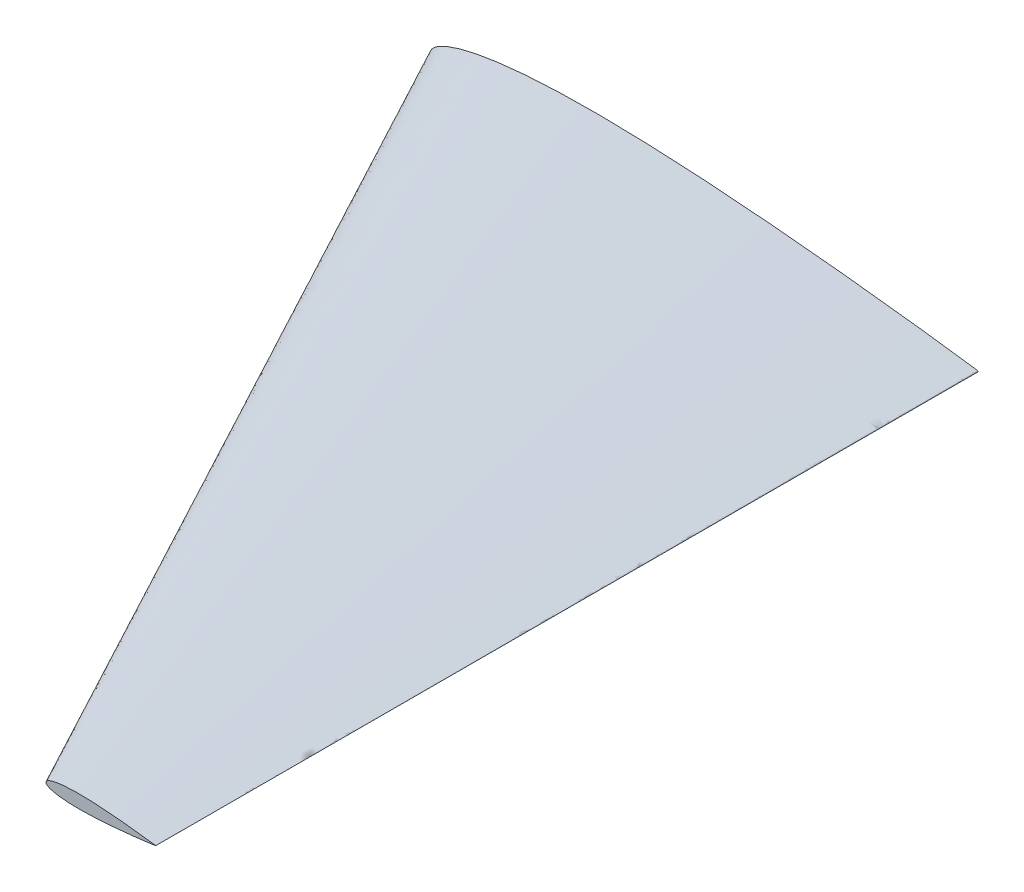
ISO-10303-21;
HEADER;
FILE_DESCRIPTION(('STEP AP214'),'2;1');
FILE_NAME('part.step','',(''),(''),'','','');
FILE_SCHEMA(('AUTOMOTIVE_DESIGN { 1 0 10303 214 1 1 1 1 }'));
ENDSEC;
DATA;
#1=APPLICATION_CONTEXT('core data for automotive mechanical design processes');
#2=APPLICATION_PROTOCOL_DEFINITION('international standard','automotive_design',2000,#1);
#3=PRODUCT_CONTEXT('',#1,'mechanical');
#4=PRODUCT('Part','Part','',(#3));
#5=PRODUCT_RELATED_PRODUCT_CATEGORY('part','',(#4));
#6=PRODUCT_DEFINITION_FORMATION('','',#4);
#7=PRODUCT_DEFINITION_CONTEXT('part definition',#1,'design');
#8=PRODUCT_DEFINITION('design','',#6,#7);
#9=PRODUCT_DEFINITION_SHAPE('','',#8);
#10=(LENGTH_UNIT() NAMED_UNIT(*) SI_UNIT(.MILLI.,.METRE.));
#11=(NAMED_UNIT(*) PLANE_ANGLE_UNIT() SI_UNIT($,.RADIAN.));
#12=(NAMED_UNIT(*) SI_UNIT($,.STERADIAN.) SOLID_ANGLE_UNIT());
#13=UNCERTAINTY_MEASURE_WITH_UNIT(LENGTH_MEASURE(1.E-05),#10,'distance_accuracy_value','');
#14=(GEOMETRIC_REPRESENTATION_CONTEXT(3) GLOBAL_UNCERTAINTY_ASSIGNED_CONTEXT((#13)) GLOBAL_UNIT_ASSIGNED_CONTEXT((#10,
#11,#12)) REPRESENTATION_CONTEXT('',''));
#15=CARTESIAN_POINT('',(0.,0.,0.));
#16=DIRECTION('',(0.,0.,1.));
#17=DIRECTION('',(1.,0.,0.));
#18=AXIS2_PLACEMENT_3D('',#15,#16,#17);
#19=CARTESIAN_POINT('',(71.9872776848649,0.,135.));
#20=DIRECTION('',(0.,0.,-1.));
#21=DIRECTION('',(-1.,0.,0.));
#22=AXIS2_PLACEMENT_3D('',#19,#20,#21);
#23=PLANE('',#22);
#24=CARTESIAN_POINT('',(89.9872776848646,0.0226799999999994,135.));
#25=CARTESIAN_POINT('',(89.9780317716978,0.0239766206020982,135.));
#26=CARTESIAN_POINT('',(89.9410984877074,0.0291560394503503,135.));
#27=CARTESIAN_POINT('',(89.8582117858611,0.0407118634468391,135.));
#28=CARTESIAN_POINT('',(89.7206394322119,0.059807249954493,135.));
#29=CARTESIAN_POINT('',(89.5292220597364,0.0860059219771913,135.));
#30=CARTESIAN_POINT('',(89.2851490708686,0.119006933475806,135.));
#31=CARTESIAN_POINT('',(88.9899125671492,0.158143589015423,135.));
#32=CARTESIAN_POINT('',(88.6453359839478,0.202889507317394,135.));
#33=CARTESIAN_POINT('',(88.2535486096725,0.252540962457441,135.));
#34=CARTESIAN_POINT('',(87.8169615624754,0.306431323723584,135.));
#35=CARTESIAN_POINT('',(87.3382671117737,0.363766135927405,135.));
#36=CARTESIAN_POINT('',(86.820419745492,0.423854584317358,135.));
#37=CARTESIAN_POINT('',(86.2666046942588,0.485872391284056,135.));
#38=CARTESIAN_POINT('',(85.6802394555611,0.549064221606188,135.));
#39=CARTESIAN_POINT('',(85.0649429876065,0.612644679447996,135.));
#40=CARTESIAN_POINT('',(84.424507395239,0.675793255591111,135.));
#41=CARTESIAN_POINT('',(83.5320816517926,0.759192361166169,135.));
#42=CARTESIAN_POINT('',(82.6194310498511,0.836875781137944,135.));
#43=CARTESIAN_POINT('',(81.6921495845967,0.906417322320732,135.));
#44=CARTESIAN_POINT('',(80.9874680361457,0.953913244523843,135.));
#45=CARTESIAN_POINT('',(80.2827801574145,0.995390436238432,135.));
#46=CARTESIAN_POINT('',(79.5824241672124,1.02980102848441,135.));
#47=CARTESIAN_POINT('',(78.8907254417731,1.05622743081398,135.));
#48=CARTESIAN_POINT('',(78.2119285792366,1.07380751477171,135.));
#49=CARTESIAN_POINT('',(77.5502284056984,1.08168260247847,135.));
#50=CARTESIAN_POINT('',(76.9096907949478,1.07922772364343,135.));
#51=CARTESIAN_POINT('',(76.2942648283648,1.06596869857278,135.));
#52=CARTESIAN_POINT('',(75.7077387337043,1.04156942547581,135.));
#53=CARTESIAN_POINT('',(75.1537226914917,1.00596607965764,135.));
#54=CARTESIAN_POINT('',(74.6356217044962,0.959265789233623,135.));
#55=CARTESIAN_POINT('',(74.1566061819425,0.901833285472628,135.));
#56=CARTESIAN_POINT('',(73.7195958769425,0.83415723398208,135.));
#57=CARTESIAN_POINT('',(73.3272389662347,0.756944453278157,135.));
#58=CARTESIAN_POINT('',(72.981835107662,0.671068008885834,135.));
#59=CARTESIAN_POINT('',(72.6853470357975,0.577365303228112,135.));
#60=CARTESIAN_POINT('',(72.4392811045721,0.476709046869523,135.));
#61=CARTESIAN_POINT('',(72.2444220250865,0.369780226703964,135.));
#62=CARTESIAN_POINT('',(72.1010696390192,0.256367798219746,135.));
#63=CARTESIAN_POINT('',(72.0092536020518,0.133728057061829,135.));
#64=CARTESIAN_POINT('',(71.977036126117,0.,135.));
#65=CARTESIAN_POINT('',(72.0092536020518,-0.13372805706183,135.));
#66=CARTESIAN_POINT('',(72.1010696390192,-0.256367798219747,135.));
#67=CARTESIAN_POINT('',(72.2444220250865,-0.369780226703963,135.));
#68=CARTESIAN_POINT('',(72.4392811045721,-0.476709046869526,135.));
#69=CARTESIAN_POINT('',(72.6853470357975,-0.57736530322811,135.));
#70=CARTESIAN_POINT('',(72.981835107662,-0.671068008885836,135.));
#71=CARTESIAN_POINT('',(73.3272389662347,-0.756944453278155,135.));
#72=CARTESIAN_POINT('',(73.7195958769425,-0.834157233982082,135.));
#73=CARTESIAN_POINT('',(74.1566061819425,-0.901833285472626,135.));
#74=CARTESIAN_POINT('',(74.6356217044962,-0.959265789233622,135.));
#75=CARTESIAN_POINT('',(75.1537226914917,-1.00596607965764,135.));
#76=CARTESIAN_POINT('',(75.7077387337043,-1.04156942547581,135.));
#77=CARTESIAN_POINT('',(76.2942648283648,-1.06596869857278,135.));
#78=CARTESIAN_POINT('',(76.9096907949478,-1.07922772364343,135.));
#79=CARTESIAN_POINT('',(77.5502284056984,-1.08168260247847,135.));
#80=CARTESIAN_POINT('',(78.2119285792366,-1.07380751477171,135.));
#81=CARTESIAN_POINT('',(78.8907254417731,-1.05622743081398,135.));
#82=CARTESIAN_POINT('',(79.5824241672124,-1.02980102848441,135.));
#83=CARTESIAN_POINT('',(80.2827801574145,-0.995390436238431,135.));
#84=CARTESIAN_POINT('',(80.9874680361457,-0.953913244523842,135.));
#85=CARTESIAN_POINT('',(81.6921495845966,-0.906417322320732,135.));
#86=CARTESIAN_POINT('',(82.6194310498511,-0.836875781137943,135.));
#87=CARTESIAN_POINT('',(83.5320816517926,-0.759192361166169,135.));
#88=CARTESIAN_POINT('',(84.424507395239,-0.675793255591111,135.));
#89=CARTESIAN_POINT('',(85.0649429876065,-0.612644679447997,135.));
#90=CARTESIAN_POINT('',(85.6802394555611,-0.549064221606188,135.));
#91=CARTESIAN_POINT('',(86.2666046942588,-0.485872391284056,135.));
#92=CARTESIAN_POINT('',(86.820419745492,-0.423854584317358,135.));
#93=CARTESIAN_POINT('',(87.3382671117737,-0.363766135927405,135.));
#94=CARTESIAN_POINT('',(87.8169615624754,-0.306431323723584,135.));
#95=CARTESIAN_POINT('',(88.2535486096725,-0.252540962457441,135.));
#96=CARTESIAN_POINT('',(88.6453359839478,-0.202889507317394,135.));
#97=CARTESIAN_POINT('',(88.9899125671492,-0.158143589015422,135.));
#98=CARTESIAN_POINT('',(89.2851490708686,-0.119006933475806,135.));
#99=CARTESIAN_POINT('',(89.5292220597364,-0.0860059219771903,135.));
#100=CARTESIAN_POINT('',(89.7206394322119,-0.059807249954493,135.));
#101=CARTESIAN_POINT('',(89.8582117858611,-0.0407118634468391,135.));
#102=CARTESIAN_POINT('',(89.9410984877074,-0.0291560394503503,135.));
#103=CARTESIAN_POINT('',(89.9780317716978,-0.0239766206020982,135.));
#104=CARTESIAN_POINT('',(89.9872776848646,-0.0226799999999994,135.));
#105=B_SPLINE_CURVE_WITH_KNOTS('',3,(#24,#25,#26,#27,#28,#29,#30,#31,#32,#33,#34,#35,#36,#37,
#38,#39,#40,#41,#42,#43,#44,#45,#46,#47,#48,#49,#50,#51,#52,#53,#54,#55,#56,#57,#58,#59,#60,#61,
#62,#63,#64,#65,#66,#67,#68,#69,#70,#71,#72,#73,#74,#75,#76,#77,#78,#79,#80,#81,#82,#83,#84,#85,
#86,#87,#88,#89,#90,#91,#92,#93,#94,#95,#96,#97,#98,#99,#100,#101,#102,#103,#104),.UNSPECIFIED.,
.F.,.F.,(4,1,1,1,1,1,1,1,1,1,1,1,1,1,1,1,1,1,1,1,1,1,1,1,1,1,1,1,1,1,1,1,1,1,1,1,1,1,1,1,1,1,1,
1,1,1,1,1,1,1,1,1,1,1,1,1,1,1,1,1,1,1,1,1,1,1,1,1,1,1,1,1,1,1,1,1,1,1,4),(0.,
0.000763156679271388,0.00304846929193472,0.00684068957953668,0.0121161317605396,
0.0188407924276644,0.026972749518207,0.0364598537113802,0.0472429445210446,0.0592535547279476,
0.0724172643119225,0.0866510217067198,0.101866322474926,0.117968955401192,0.134857918638583,
0.152428309483259,0.170571841082248,0.208122338288737,0.227296649324545,0.246580070424687,
0.265853108019993,0.284996761496293,0.303895241632262,0.322432580929281,0.340498658943124,
0.357984483489282,0.37478811429809,0.390812303248415,0.405965006366899,0.420162443159487,
0.433328264782086,0.445393603392471,0.456301171479378,0.466003880875037,0.474472000637231,
0.481696232103684,0.487703697963338,0.492583405321471,0.496543603187854,0.5,0.503456396812145,
0.507416594678528,0.512296302036662,0.518303767896316,0.525527999362769,0.533996119124963,
0.543698828520621,0.554606396607529,0.566671735217914,0.579837556840513,0.594034993633101,
0.609187696751585,0.62521188570191,0.642015516510718,0.659501341056876,0.677567419070718,
0.696104758367738,0.715003238503707,0.734146891980006,0.753419929575313,0.772703350675455,
0.791877661711263,0.829428158917752,0.847571690516741,0.865142081361417,0.882031044598808,
0.898133677525074,0.91334897829328,0.927582735688077,0.940746445272052,0.952757055478955,
0.96354014628862,0.973027250481793,0.981159207572336,0.98788386823946,0.993159310420463,
0.996951530708065,0.999236843320729,1.),.UNSPECIFIED.);
#106=CARTESIAN_POINT('',(89.9872648153313,0.0226818047860015,135.));
#107=VERTEX_POINT('',#106);
#108=CARTESIAN_POINT('',(89.9872776848646,-0.0226799999999997,135.));
#109=VERTEX_POINT('',#108);
#110=EDGE_CURVE('E100',#107,#109,#105,.T.);
#111=ORIENTED_EDGE('',*,*,#110,.T.);
#112=CARTESIAN_POINT('',(89.9840971060807,0.,135.));
#113=DIRECTION('',(0.,0.,1.));
#114=DIRECTION('',(1.,0.,0.));
#115=AXIS2_PLACEMENT_3D('',#112,#113,#114);
#116=CIRCLE('',#115,0.0229019318268203);
#117=EDGE_CURVE('E12',#109,#107,#116,.T.);
#118=ORIENTED_EDGE('',*,*,#117,.T.);
#119=EDGE_LOOP('',(#111,#118));
#120=FACE_BOUND('',#119,.T.);
#121=ADVANCED_FACE('F89',(#120),#23,.F.);
#122=CARTESIAN_POINT('',(0.,0.,0.));
#123=DIRECTION('',(0.,0.,-1.));
#124=DIRECTION('',(-1.,0.,0.));
#125=AXIS2_PLACEMENT_3D('',#122,#123,#124);
#126=PLANE('',#125);
#127=CARTESIAN_POINT('',(39.9840971060807,0.,0.));
#128=DIRECTION('',(0.,0.,-1.));
#129=DIRECTION('',(-1.,0.,0.));
#130=AXIS2_PLACEMENT_3D('',#127,#128,#129);
#131=CIRCLE('',#130,3.);
#132=CARTESIAN_POINT('',(36.9840971060807,0.,0.));
#133=VERTEX_POINT('',#132);
#134=EDGE_CURVE('E232',#133,#133,#131,.T.);
#135=ORIENTED_EDGE('',*,*,#134,.F.);
#136=EDGE_LOOP('',(#135));
#137=FACE_BOUND('',#136,.T.);
#138=CARTESIAN_POINT('',(90.,0.1134,0.));
#139=CARTESIAN_POINT('',(89.9537704341662,0.119883103010493,0.));
#140=CARTESIAN_POINT('',(89.7691040142139,0.145780197251754,0.));
#141=CARTESIAN_POINT('',(89.3546705049829,0.203559317234198,0.));
#142=CARTESIAN_POINT('',(88.6668087367366,0.299036249772468,0.));
#143=CARTESIAN_POINT('',(87.7097218743593,0.430029609885964,0.));
#144=CARTESIAN_POINT('',(86.4893569300202,0.595034667379039,0.));
#145=CARTESIAN_POINT('',(85.0131744114233,0.790717945077129,0.));
#146=CARTESIAN_POINT('',(83.290291495416,1.01444753658698,0.));
#147=CARTESIAN_POINT('',(81.3313546240398,1.26270481228723,0.));
#148=CARTESIAN_POINT('',(79.148419388054,1.53215661861794,0.));
#149=CARTESIAN_POINT('',(76.7549471345454,1.81883067963706,0.));
#150=CARTESIAN_POINT('',(74.1657103031369,2.11927292158682,0.));
#151=CARTESIAN_POINT('',(71.3966350469709,2.42936195642032,0.));
#152=CARTESIAN_POINT('',(68.4648088534825,2.74532110803098,0.));
#153=CARTESIAN_POINT('',(65.3883265137093,3.06322339724003,0.));
#154=CARTESIAN_POINT('',(62.1861485518716,3.37896627795561,0.));
#155=CARTESIAN_POINT('',(58.8780260551272,3.68811744194574,0.));
#156=CARTESIAN_POINT('',(55.484331913351,3.98661843658791,0.));
#157=CARTESIAN_POINT('',(52.0260264687444,4.26947884154361,0.));
#158=CARTESIAN_POINT('',(48.5243594986598,4.53208661160373,0.));
#159=CARTESIAN_POINT('',(45.0009517564049,4.76956622261929,0.));
#160=CARTESIAN_POINT('',(41.477512362749,4.97695218119224,0.));
#161=CARTESIAN_POINT('',(37.9757324117386,5.14900514242214,0.));
#162=CARTESIAN_POINT('',(34.5172387845418,5.28113715407001,0.));
#163=CARTESIAN_POINT('',(31.1232544718593,5.36903757385864,0.));
#164=CARTESIAN_POINT('',(27.8147536041682,5.40841301239242,0.));
#165=CARTESIAN_POINT('',(24.6120655504152,5.39613861821724,0.));
#166=CARTESIAN_POINT('',(21.5349357175002,5.32984349286397,0.));
#167=CARTESIAN_POINT('',(18.6023052441976,5.20784712737914,0.));
#168=CARTESIAN_POINT('',(15.8322250331345,5.0298303982883,0.));
#169=CARTESIAN_POINT('',(13.2417200981571,4.79632894616819,0.));
#170=CARTESIAN_POINT('',(10.8466424853882,4.50916642736321,0.));
#171=CARTESIAN_POINT('',(8.66159096038823,4.17078616991047,0.));
#172=CARTESIAN_POINT('',(6.69980640684945,3.78472226639084,0.));
#173=CARTESIAN_POINT('',(4.97278711398595,3.35534004442923,0.));
#174=CARTESIAN_POINT('',(3.49034675466336,2.8868265161406,0.));
#175=CARTESIAN_POINT('',(2.26001709853658,2.38354523434766,0.));
#176=CARTESIAN_POINT('',(1.28572170110845,1.84890113351985,0.));
#177=CARTESIAN_POINT('',(0.568959770771791,1.28183899109876,0.));
#178=CARTESIAN_POINT('',(0.109879585934893,0.668640285309151,0.));
#179=CARTESIAN_POINT('',(-0.0512077937391864,0.,0.));
#180=CARTESIAN_POINT('',(0.10987958593489,-0.668640285309145,0.));
#181=CARTESIAN_POINT('',(0.568959770771796,-1.28183899109877,0.));
#182=CARTESIAN_POINT('',(1.28572170110845,-1.84890113351984,0.));
#183=CARTESIAN_POINT('',(2.26001709853658,-2.38354523434766,0.));
#184=CARTESIAN_POINT('',(3.49034675466337,-2.88682651614061,0.));
#185=CARTESIAN_POINT('',(4.97278711398594,-3.35534004442922,0.));
#186=CARTESIAN_POINT('',(6.69980640684945,-3.78472226639084,0.));
#187=CARTESIAN_POINT('',(8.66159096038822,-4.17078616991047,0.));
#188=CARTESIAN_POINT('',(10.8466424853882,-4.50916642736321,0.));
#189=CARTESIAN_POINT('',(13.2417200981571,-4.79632894616819,0.));
#190=CARTESIAN_POINT('',(15.8322250331345,-5.0298303982883,0.));
#191=CARTESIAN_POINT('',(18.6023052441976,-5.20784712737914,0.));
#192=CARTESIAN_POINT('',(21.5349357175002,-5.32984349286397,0.));
#193=CARTESIAN_POINT('',(24.6120655504151,-5.39613861821725,0.));
#194=CARTESIAN_POINT('',(27.8147536041682,-5.40841301239242,0.));
#195=CARTESIAN_POINT('',(31.1232544718593,-5.36903757385864,0.));
#196=CARTESIAN_POINT('',(34.5172387845418,-5.28113715407,0.));
#197=CARTESIAN_POINT('',(37.9757324117386,-5.14900514242214,0.));
#198=CARTESIAN_POINT('',(41.477512362749,-4.97695218119224,0.));
#199=CARTESIAN_POINT('',(45.0009517564049,-4.76956622261929,0.));
#200=CARTESIAN_POINT('',(48.5243594986598,-4.53208661160373,0.));
#201=CARTESIAN_POINT('',(52.0260264687444,-4.26947884154361,0.));
#202=CARTESIAN_POINT('',(55.484331913351,-3.98661843658791,0.));
#203=CARTESIAN_POINT('',(58.8780260551272,-3.68811744194574,0.));
#204=CARTESIAN_POINT('',(62.1861485518716,-3.37896627795561,0.));
#205=CARTESIAN_POINT('',(65.3883265137093,-3.06322339724003,0.));
#206=CARTESIAN_POINT('',(68.4648088534825,-2.74532110803098,0.));
#207=CARTESIAN_POINT('',(71.3966350469709,-2.42936195642032,0.));
#208=CARTESIAN_POINT('',(74.165710303137,-2.11927292158682,0.));
#209=CARTESIAN_POINT('',(76.7549471345454,-1.81883067963705,0.));
#210=CARTESIAN_POINT('',(79.148419388054,-1.53215661861794,0.));
#211=CARTESIAN_POINT('',(81.3313546240398,-1.26270481228723,0.));
#212=CARTESIAN_POINT('',(83.290291495416,-1.01444753658698,0.));
#213=CARTESIAN_POINT('',(85.0131744114233,-0.790717945077128,0.));
#214=CARTESIAN_POINT('',(86.4893569300202,-0.595034667379039,0.));
#215=CARTESIAN_POINT('',(87.7097218743593,-0.430029609885965,0.));
#216=CARTESIAN_POINT('',(88.6668087367366,-0.299036249772464,0.));
#217=CARTESIAN_POINT('',(89.3546705049829,-0.203559317234202,0.));
#218=CARTESIAN_POINT('',(89.7691040142139,-0.145780197251752,0.));
#219=CARTESIAN_POINT('',(89.9537704341662,-0.119883103010493,0.));
#220=CARTESIAN_POINT('',(90.,-0.1134,0.));
#221=B_SPLINE_CURVE_WITH_KNOTS('',3,(#138,#139,#140,#141,#142,#143,#144,#145,#146,#147,#148,
#149,#150,#151,#152,#153,#154,#155,#156,#157,#158,#159,#160,#161,#162,#163,#164,#165,#166,#167,
#168,#169,#170,#171,#172,#173,#174,#175,#176,#177,#178,#179,#180,#181,#182,#183,#184,#185,#186,
#187,#188,#189,#190,#191,#192,#193,#194,#195,#196,#197,#198,#199,#200,#201,#202,#203,#204,#205,
#206,#207,#208,#209,#210,#211,#212,#213,#214,#215,#216,#217,#218,#219,#220),.UNSPECIFIED.,.F.,
.F.,(4,1,1,1,1,1,1,1,1,1,1,1,1,1,1,1,1,1,1,1,1,1,1,1,1,1,1,1,1,1,1,1,1,1,1,1,1,1,1,1,1,1,1,1,1,
1,1,1,1,1,1,1,1,1,1,1,1,1,1,1,1,1,1,1,1,1,1,1,1,1,1,1,1,1,1,1,1,1,1,1,4),(0.,
0.000763156679271388,0.00304846929193475,0.00684068957953672,0.0121161317605396,
0.0188407924276644,0.0269727495182071,0.0364598537113804,0.0472429445210447,0.0592535547279477,
0.0724172643119224,0.0866510217067198,0.101866322474926,0.117968955401192,0.134857918638583,
0.152428309483259,0.170571841082248,0.189174521814913,0.208122338288737,0.227296649324545,
0.246580070424687,0.265853108019994,0.284996761496293,0.303895241632262,0.322432580929281,
0.340498658943124,0.357984483489282,0.37478811429809,0.390812303248415,0.405965006366899,
0.420162443159487,0.433328264782086,0.445393603392471,0.456301171479378,0.466003880875037,
0.474472000637231,0.481696232103684,0.487703697963338,0.492583405321472,0.496543603187855,0.5,
0.503456396812145,0.507416594678528,0.512296302036662,0.518303767896316,0.525527999362769,
0.533996119124963,0.543698828520622,0.554606396607529,0.566671735217914,0.579837556840513,
0.594034993633101,0.609187696751585,0.62521188570191,0.642015516510718,0.659501341056876,
0.677567419070719,0.696104758367738,0.715003238503707,0.734146891980006,0.753419929575313,
0.772703350675455,0.791877661711263,0.810825478185087,0.829428158917752,0.847571690516741,
0.865142081361417,0.882031044598808,0.898133677525074,0.91334897829328,0.927582735688077,
0.940746445272052,0.952757055478955,0.96354014628862,0.973027250481793,0.981159207572336,
0.98788386823946,0.993159310420463,0.996951530708065,0.999236843320729,1.),.UNSPECIFIED.);
#222=CARTESIAN_POINT('',(90.,0.1134,0.));
#223=VERTEX_POINT('',#222);
#224=CARTESIAN_POINT('',(-0.0001690255250427,1.88299271817094E-13,0.));
#225=VERTEX_POINT('',#224);
#226=EDGE_CURVE('E127',#223,#225,#221,.T.);
#227=ORIENTED_EDGE('',*,*,#226,.F.);
#228=CARTESIAN_POINT('',(89.9840971060807,0.,0.));
#229=DIRECTION('',(0.,0.,1.));
#230=DIRECTION('',(1.,0.,0.));
#231=AXIS2_PLACEMENT_3D('',#228,#229,#230);
#232=CIRCLE('',#231,0.114509659134105);
#233=CARTESIAN_POINT('',(90.,-0.1134,0.));
#234=VERTEX_POINT('',#233);
#235=EDGE_CURVE('E122',#234,#223,#232,.T.);
#236=ORIENTED_EDGE('',*,*,#235,.F.);
#237=CARTESIAN_POINT('',(90.0000005738889,-0.113399919519454,0.));
#238=CARTESIAN_POINT('',(90.0270547402874,-0.109605920063445,0.));
#239=CARTESIAN_POINT('',(90.0782179790276,-0.0819338008261658,0.));
#240=CARTESIAN_POINT('',(90.1088829458505,0.000104478949159383,0.));
#241=CARTESIAN_POINT('',(90.0781972142959,0.0818648234108423,0.));
#242=CARTESIAN_POINT('',(90.0270547402874,0.109605920063445,0.));
#243=CARTESIAN_POINT('',(88.106710224714,0.378909580730713,0.));
#244=CARTESIAN_POINT('',(84.3173708861576,0.890124496622106,0.));
#245=CARTESIAN_POINT('',(78.6262584032681,1.60231045487989,0.));
#246=CARTESIAN_POINT('',(72.9292196330937,2.26529990932935,0.));
#247=CARTESIAN_POINT('',(67.2268298691047,2.8805878580544,0.));
#248=CARTESIAN_POINT('',(62.470739371454,3.35381734804142,0.));
#249=CARTESIAN_POINT('',(58.6634221309621,3.706701663112,0.));
#250=CARTESIAN_POINT('',(55.8067333572908,3.95806613568878,0.));
#251=CARTESIAN_POINT('',(52.9488061681589,4.19496520721767,0.));
#252=CARTESIAN_POINT('',(50.0896379414459,4.41639519667294,0.));
#253=CARTESIAN_POINT('',(47.229218949441,4.62106665123658,0.));
#254=CARTESIAN_POINT('',(44.3675453995081,4.80741984981751,0.));
#255=CARTESIAN_POINT('',(41.5046233346376,4.97355585124369,0.));
#256=CARTESIAN_POINT('',(38.6404753554098,5.11711608636138,0.));
#257=CARTESIAN_POINT('',(35.7751756640179,5.23561982955822,0.));
#258=CARTESIAN_POINT('',(32.9088493498352,5.32619229416925,0.));
#259=CARTESIAN_POINT('',(30.0416874817761,5.385186373508,0.));
#260=CARTESIAN_POINT('',(27.1739988816486,5.40826787086757,0.));
#261=CARTESIAN_POINT('',(24.784207296407,5.39350485258589,0.));
#262=CARTESIAN_POINT('',(22.8727013067461,5.35821662559248,0.));
#263=CARTESIAN_POINT('',(21.4393630947476,5.31902570333192,0.));
#264=CARTESIAN_POINT('',(20.0064618066811,5.26612595034227,0.));
#265=CARTESIAN_POINT('',(18.5741874499888,5.19827501029936,0.));
#266=CARTESIAN_POINT('',(17.1427690951484,5.11421506718784,0.));
#267=CARTESIAN_POINT('',(15.7125072706613,5.01226150916699,0.));
#268=CARTESIAN_POINT('',(14.2837818556115,4.89059815051954,0.));
#269=CARTESIAN_POINT('',(12.857090305246,4.74690996316597,0.));
#270=CARTESIAN_POINT('',(11.4331010763499,4.57845533202487,0.));
#271=CARTESIAN_POINT('',(10.0127284060081,4.38161597701241,0.));
#272=CARTESIAN_POINT('',(8.59731250271884,4.15168214817327,0.));
#273=CARTESIAN_POINT('',(7.42351038656699,3.92742679990385,0.));
#274=CARTESIAN_POINT('',(6.48950456574575,3.72376577392631,0.));
#275=CARTESIAN_POINT('',(5.79206554514202,3.55758397697753,0.));
#276=CARTESIAN_POINT('',(5.09857458015349,3.3755271813296,0.));
#277=CARTESIAN_POINT('',(4.40996717172164,3.17581099208411,0.));
#278=CARTESIAN_POINT('',(3.72790930092868,2.95448895137806,0.));
#279=CARTESIAN_POINT('',(3.05470701008203,2.7076913114081,0.));
#280=CARTESIAN_POINT('',(2.39372496762815,2.42897318424543,0.));
#281=CARTESIAN_POINT('',(1.75184737815108,2.1090896895656,0.));
#282=CARTESIAN_POINT('',(1.13893235314406,1.73463164885196,0.));
#283=CARTESIAN_POINT('',(0.581639954224861,1.28053655979895,0.));
#284=CARTESIAN_POINT('',(0.129851249371971,0.714313688424324,0.));
#285=CARTESIAN_POINT('',(-0.0651791629735788,-1.11239142897013E-13,0.));
#286=CARTESIAN_POINT('',(0.129851249372081,-0.714313688424518,0.));
#287=CARTESIAN_POINT('',(0.581639954224998,-1.28053655979907,0.));
#288=CARTESIAN_POINT('',(1.13893235314423,-1.73463164885209,0.));
#289=CARTESIAN_POINT('',(1.75184737815125,-2.10908968956568,0.));
#290=CARTESIAN_POINT('',(2.39372496762832,-2.42897318424551,0.));
#291=CARTESIAN_POINT('',(3.05470701008223,-2.70769131140818,0.));
#292=CARTESIAN_POINT('',(3.72790930092884,-2.95448895137811,0.));
#293=CARTESIAN_POINT('',(4.40996717172183,-3.17581099208417,0.));
#294=CARTESIAN_POINT('',(5.09857458015361,-3.37552718132962,0.));
#295=CARTESIAN_POINT('',(5.79206554514216,-3.55758397697758,0.));
#296=CARTESIAN_POINT('',(6.48950456574591,-3.72376577392634,0.));
#297=CARTESIAN_POINT('',(7.42351038656714,-3.9274267999039,0.));
#298=CARTESIAN_POINT('',(8.59731250271904,-4.15168214817329,0.));
#299=CARTESIAN_POINT('',(10.0127284060082,-4.38161597701244,0.));
#300=CARTESIAN_POINT('',(11.4331010763501,-4.57845533202489,0.));
#301=CARTESIAN_POINT('',(12.8570903052461,-4.74690996316597,0.));
#302=CARTESIAN_POINT('',(14.2837818556117,-4.89059815051957,0.));
#303=CARTESIAN_POINT('',(15.7125072706614,-5.01226150916699,0.));
#304=CARTESIAN_POINT('',(17.1427690951486,-5.11421506718786,0.));
#305=CARTESIAN_POINT('',(18.5741874499889,-5.19827501029936,0.));
#306=CARTESIAN_POINT('',(20.0064618066812,-5.26612595034227,0.));
#307=CARTESIAN_POINT('',(21.4393630947477,-5.31902570333192,0.));
#308=CARTESIAN_POINT('',(22.8727013067463,-5.35821662559249,0.));
#309=CARTESIAN_POINT('',(24.784207296407,-5.39350485258588,0.));
#310=CARTESIAN_POINT('',(27.1739988816489,-5.40826787086759,0.));
#311=CARTESIAN_POINT('',(30.0416874817762,-5.38518637350799,0.));
#312=CARTESIAN_POINT('',(32.9088493498354,-5.32619229416925,0.));
#313=CARTESIAN_POINT('',(35.775175664018,-5.2356198295582,0.));
#314=CARTESIAN_POINT('',(38.64047535541,-5.11711608636139,0.));
#315=CARTESIAN_POINT('',(41.5046233346377,-4.97355585124367,0.));
#316=CARTESIAN_POINT('',(44.3675453995082,-4.80741984981752,0.));
#317=CARTESIAN_POINT('',(47.2292189494411,-4.62106665123657,0.));
#318=CARTESIAN_POINT('',(50.0896379414459,-4.41639519667294,0.));
#319=CARTESIAN_POINT('',(52.9488061681589,-4.19496520721767,0.));
#320=CARTESIAN_POINT('',(55.8067333572908,-3.95806613568879,0.));
#321=CARTESIAN_POINT('',(58.663422130962,-3.706701663112,0.));
#322=CARTESIAN_POINT('',(62.4707393714541,-3.35381734804143,0.));
#323=CARTESIAN_POINT('',(67.2268298691048,-2.88058785805441,0.));
#324=CARTESIAN_POINT('',(72.9292196330935,-2.26529990932933,0.));
#325=CARTESIAN_POINT('',(78.6262584032683,-1.60231045487994,0.));
#326=CARTESIAN_POINT('',(84.3173708861575,-0.890124496621991,0.));
#327=CARTESIAN_POINT('',(88.106710224714,-0.378909580730866,0.));
#328=CARTESIAN_POINT('',(90.0000005738889,-0.113399919519454,0.));
#329=B_SPLINE_CURVE_WITH_KNOTS('',3,(#237,#238,#239,#240,#241,#242,#243,#244,#245,#246,#247,
#248,#249,#250,#251,#252,#253,#254,#255,#256,#257,#258,#259,#260,#261,#262,#263,#264,#265,#266,
#267,#268,#269,#270,#271,#272,#273,#274,#275,#276,#277,#278,#279,#280,#281,#282,#283,#284,#285,
#286,#287,#288,#289,#290,#291,#292,#293,#294,#295,#296,#297,#298,#299,#300,#301,#302,#303,#304,
#305,#306,#307,#308,#309,#310,#311,#312,#313,#314,#315,#316,#317,#318,#319,#320,#321,#322,#323,
#324,#325,#326,#327,#328),.UNSPECIFIED.,.T.,.F.,(4,1,1,1,2,1,1,1,1,1,1,1,1,1,1,1,1,1,1,1,1,1,1,
1,1,1,1,1,1,1,1,1,1,1,1,1,1,1,1,1,1,1,1,1,1,1,1,1,1,1,1,1,1,1,1,1,1,1,1,1,1,1,1,1,1,1,1,1,1,1,1,
1,1,1,1,1,1,1,1,1,1,1,1,1,1,1,1,1,4),(0.,0.000445750581268703,0.000891501162537406,
0.00133725174380611,0.00178300232507481,0.0329772835024162,0.0641715646797577,
0.0953658458570991,0.126560127034441,0.157754408211782,0.173351548800453,0.188948689389123,
0.204545829977794,0.220142970566465,0.235740111155136,0.251337251743806,0.266934392332477,
0.282531532921148,0.298128673509818,0.313725814098489,0.32932295468716,0.344920095275831,
0.360517235864501,0.368315806158837,0.376114376453172,0.383912946747507,0.391711517041842,
0.399510087336178,0.407308657630513,0.415107227924849,0.422905798219184,0.430704368513519,
0.438502938807855,0.44630150910219,0.454100079396525,0.457999364543693,0.461898649690861,
0.465797934838029,0.469697219985196,0.473596505132364,0.477495790279532,0.481395075426699,
0.485294360573867,0.489193645721035,0.493092930868202,0.49699221601537,0.500891501162537,
0.504790786309705,0.508690071456873,0.51258935660404,0.516488641751208,0.520387926898376,
0.524287212045543,0.528186497192711,0.532085782339879,0.535985067487046,0.539884352634214,
0.543783637781382,0.547682922928549,0.555481493222885,0.56328006351722,0.571078633811555,
0.578877204105891,0.586675774400226,0.594474344694562,0.602272914988897,0.610071485283232,
0.617870055577568,0.625668625871903,0.633467196166238,0.641265766460574,0.656862907049244,
0.672460047637915,0.688057188226586,0.703654328815257,0.719251469403927,0.734848609992598,
0.750445750581269,0.76604289116994,0.78164003175861,0.797237172347281,0.812834312935952,
0.828431453524622,0.844028594113293,0.875222875290635,0.906417156467976,0.937611437645318,
0.968805718822659,1.),.UNSPECIFIED.);
#330=EDGE_CURVE('E93',#225,#234,#329,.T.);
#331=ORIENTED_EDGE('',*,*,#330,.F.);
#332=EDGE_LOOP('',(#227,#236,#331));
#333=FACE_BOUND('',#332,.T.);
#334=ADVANCED_FACE('F125',(#137,#333),#126,.T.);
#335=CARTESIAN_POINT('',(90.0000005738889,-0.113399919519454,0.));
#336=CARTESIAN_POINT('',(89.987277799944,-0.022679983861586,135.));
#337=CARTESIAN_POINT('',(90.0270547402874,-0.109605920063445,0.));
#338=CARTESIAN_POINT('',(89.9926886332212,-0.0219211839707338,135.));
#339=CARTESIAN_POINT('',(90.0782179790276,-0.0819338008261658,0.));
#340=CARTESIAN_POINT('',(90.00291866369,-0.0163818071039381,135.));
#341=CARTESIAN_POINT('',(90.1088829458505,0.000104478949159383,0.));
#342=CARTESIAN_POINT('',(90.0090553575713,0.,135.));
#343=CARTESIAN_POINT('',(90.0781972142959,0.0818648234108423,0.));
#344=CARTESIAN_POINT('',(90.00291866369,0.0163818071039312,135.));
#345=CARTESIAN_POINT('',(90.0270547402874,0.109605920063445,0.));
#346=CARTESIAN_POINT('',(89.9926886332212,0.0219211839707338,135.));
#347=CARTESIAN_POINT('',(88.106710224714,0.378909580730713,0.));
#348=CARTESIAN_POINT('',(89.6086197302835,0.0757819160793903,135.));
#349=CARTESIAN_POINT('',(84.3173708861576,0.890124496622106,0.));
#350=CARTESIAN_POINT('',(88.8507558171569,0.178025002574824,135.));
#351=CARTESIAN_POINT('',(78.6262584032681,1.60231045487989,0.));
#352=CARTESIAN_POINT('',(87.712535366822,0.320466201937788,135.));
#353=CARTESIAN_POINT('',(72.9292196330937,2.26529990932935,0.));
#354=CARTESIAN_POINT('',(86.5731299838818,0.453052423817573,135.));
#355=CARTESIAN_POINT('',(67.2268298691047,2.8805878580544,0.));
#356=CARTESIAN_POINT('',(85.4326566045175,0.576126625697376,135.));
#357=CARTESIAN_POINT('',(62.470739371454,3.35381734804142,0.));
#358=CARTESIAN_POINT('',(84.4814390761731,0.6707479379602,135.));
#359=CARTESIAN_POINT('',(58.6634221309621,3.706701663112,0.));
#360=CARTESIAN_POINT('',(83.7199799449934,0.741351010108856,135.));
#361=CARTESIAN_POINT('',(55.8067333572908,3.95806613568878,0.));
#362=CARTESIAN_POINT('',(83.148641692672,0.791599963487639,135.));
#363=CARTESIAN_POINT('',(52.9488061681589,4.19496520721767,0.));
#364=CARTESIAN_POINT('',(82.5770581867294,0.838989204231806,135.));
#365=CARTESIAN_POINT('',(50.0896379414459,4.41639519667294,0.));
#366=CARTESIAN_POINT('',(82.0052266556302,0.883276449072613,135.));
#367=CARTESIAN_POINT('',(47.229218949441,4.62106665123658,0.));
#368=CARTESIAN_POINT('',(81.4331443278386,0.924219414741319,135.));
#369=CARTESIAN_POINT('',(44.3675453995081,4.80741984981751,0.));
#370=CARTESIAN_POINT('',(80.8608111428554,0.961477579198125,135.));
#371=CARTESIAN_POINT('',(41.5046233346376,4.97355585124369,0.));
#372=CARTESIAN_POINT('',(80.2882270401814,0.994710420403236,135.));
#373=CARTESIAN_POINT('',(38.6404753554098,5.11711608636138,0.));
#374=CARTESIAN_POINT('',(79.7154007063904,1.0234233168546,135.));
#375=CARTESIAN_POINT('',(35.7751756640179,5.23561982955822,0.));
#376=CARTESIAN_POINT('',(79.142340828056,1.04712164705014,135.));
#377=CARTESIAN_POINT('',(32.9088493498352,5.32619229416925,0.));
#378=CARTESIAN_POINT('',(78.5690779396688,1.06523845219665,135.));
#379=CARTESIAN_POINT('',(30.0416874817761,5.385186373508,0.));
#380=CARTESIAN_POINT('',(77.9956467909935,1.0770362716913,135.));
#381=CARTESIAN_POINT('',(27.1739988816486,5.40826787086757,0.));
#382=CARTESIAN_POINT('',(77.4221103774682,1.08165412536448,135.));
#383=CARTESIAN_POINT('',(24.784207296407,5.39350485258589,0.));
#384=CARTESIAN_POINT('',(76.9441540575878,1.07870101619561,135.));
#385=CARTESIAN_POINT('',(22.8727013067461,5.35821662559248,0.));
#386=CARTESIAN_POINT('',(76.5618529800036,1.07164417358077,135.));
#387=CARTESIAN_POINT('',(21.4393630947476,5.31902570333192,0.));
#388=CARTESIAN_POINT('',(76.2751865067536,1.06380664821628,135.));
#389=CARTESIAN_POINT('',(20.0064618066811,5.26612595034227,0.));
#390=CARTESIAN_POINT('',(75.9886067142198,1.05322651368495,135.));
#391=CARTESIAN_POINT('',(18.5741874499888,5.19827501029936,0.));
#392=CARTESIAN_POINT('',(75.7021534233125,1.03965625659458,135.));
#393=CARTESIAN_POINT('',(17.1427690951484,5.11421506718784,0.));
#394=CARTESIAN_POINT('',(75.4158664549421,1.02284836355298,135.));
#395=CARTESIAN_POINT('',(15.7125072706613,5.01226150916699,0.));
#396=CARTESIAN_POINT('',(75.1298154076277,1.00245379799267,135.));
#397=CARTESIAN_POINT('',(14.2837818556115,4.89059815051954,0.));
#398=CARTESIAN_POINT('',(74.8440698798883,0.978123523346171,135.));
#399=CARTESIAN_POINT('',(12.857090305246,4.74690996316597,0.));
#400=CARTESIAN_POINT('',(74.5587333777399,0.949384963719806,135.));
#401=CARTESIAN_POINT('',(11.4331010763499,4.57845533202487,0.));
#402=CARTESIAN_POINT('',(74.2739347588471,0.915697188354688,135.));
#403=CARTESIAN_POINT('',(10.0127284060081,4.38161597701241,0.));
#404=CARTESIAN_POINT('',(73.989863494295,0.876324331484269,135.));
#405=CARTESIAN_POINT('',(8.59731250271884,4.15168214817327,0.));
#406=CARTESIAN_POINT('',(73.7067762865259,0.830353572123081,135.));
#407=CARTESIAN_POINT('',(7.42351038656699,3.92742679990385,0.));
#408=CARTESIAN_POINT('',(73.4720248786374,0.785477857011169,135.));
#409=CARTESIAN_POINT('',(6.48950456574575,3.72376577392631,0.));
#410=CARTESIAN_POINT('',(73.2852141647488,0.744778532435082,135.));
#411=CARTESIAN_POINT('',(5.79206554514202,3.55758397697753,0.));
#412=CARTESIAN_POINT('',(73.1457368059251,0.711507149416889,135.));
#413=CARTESIAN_POINT('',(5.09857458015349,3.3755271813296,0.));
#414=CARTESIAN_POINT('',(73.0070255940757,0.675141363469721,135.));
#415=CARTESIAN_POINT('',(4.40996717172164,3.17581099208411,0.));
#416=CARTESIAN_POINT('',(72.869325318186,0.635137520999171,135.));
#417=CARTESIAN_POINT('',(3.72790930092868,2.95448895137806,0.));
#418=CARTESIAN_POINT('',(72.7328807672416,0.590951968410835,135.));
#419=CARTESIAN_POINT('',(3.05470701008203,2.7076913114081,0.));
#420=CARTESIAN_POINT('',(72.5982675474155,0.541530531206101,135.));
#421=CARTESIAN_POINT('',(2.39372496762815,2.42897318424543,0.));
#422=CARTESIAN_POINT('',(72.4660612648813,0.485819034886356,135.));
#423=CARTESIAN_POINT('',(1.75184737815108,2.1090896895656,0.));
#424=CARTESIAN_POINT('',(72.337682903564,0.421841964469401,135.));
#425=CARTESIAN_POINT('',(1.13893235314406,1.73463164885196,0.));
#426=CARTESIAN_POINT('',(72.2151102933188,0.346934890368946,135.));
#427=CARTESIAN_POINT('',(0.581639954224861,1.28053655979895,0.));
#428=CARTESIAN_POINT('',(72.1036353932669,0.256157019948565,135.));
#429=CARTESIAN_POINT('',(0.129851249371971,0.714313688424324,0.));
#430=CARTESIAN_POINT('',(72.0132943616117,0.142865451490531,135.));
#431=CARTESIAN_POINT('',(-0.0651791629735788,-1.11239142897013E-13,0.));
#432=CARTESIAN_POINT('',(71.9742018956866,0.,135.));
#433=CARTESIAN_POINT('',(0.129851249372081,-0.714313688424518,0.));
#434=CARTESIAN_POINT('',(72.0132943616117,-0.142865451490529,135.));
#435=CARTESIAN_POINT('',(0.581639954224998,-1.28053655979907,0.));
#436=CARTESIAN_POINT('',(72.1036353932669,-0.256157019948593,135.));
#437=CARTESIAN_POINT('',(1.13893235314423,-1.73463164885209,0.));
#438=CARTESIAN_POINT('',(72.2151102933188,-0.346934890368952,135.));
#439=CARTESIAN_POINT('',(1.75184737815125,-2.10908968956568,0.));
#440=CARTESIAN_POINT('',(72.3376829035641,-0.421841964469405,135.));
#441=CARTESIAN_POINT('',(2.39372496762832,-2.42897318424551,0.));
#442=CARTESIAN_POINT('',(72.4660612648812,-0.485819034886365,135.));
#443=CARTESIAN_POINT('',(3.05470701008223,-2.70769131140818,0.));
#444=CARTESIAN_POINT('',(72.5982675474156,-0.541530531206101,135.));
#445=CARTESIAN_POINT('',(3.72790930092884,-2.95448895137811,0.));
#446=CARTESIAN_POINT('',(72.7328807672416,-0.590951968410838,135.));
#447=CARTESIAN_POINT('',(4.40996717172183,-3.17581099208417,0.));
#448=CARTESIAN_POINT('',(72.869325318186,-0.635137520999179,135.));
#449=CARTESIAN_POINT('',(5.09857458015361,-3.37552718132962,0.));
#450=CARTESIAN_POINT('',(73.0070255940757,-0.675141363469729,135.));
#451=CARTESIAN_POINT('',(5.79206554514216,-3.55758397697758,0.));
#452=CARTESIAN_POINT('',(73.1457368059251,-0.711507149416895,135.));
#453=CARTESIAN_POINT('',(6.48950456574591,-3.72376577392634,0.));
#454=CARTESIAN_POINT('',(73.2852141647489,-0.744778532435087,135.));
#455=CARTESIAN_POINT('',(7.42351038656714,-3.9274267999039,0.));
#456=CARTESIAN_POINT('',(73.4720248786375,-0.785477857011174,135.));
#457=CARTESIAN_POINT('',(8.59731250271904,-4.15168214817329,0.));
#458=CARTESIAN_POINT('',(73.7067762865256,-0.830353572123082,135.));
#459=CARTESIAN_POINT('',(10.0127284060082,-4.38161597701244,0.));
#460=CARTESIAN_POINT('',(73.9898634942952,-0.876324331484272,135.));
#461=CARTESIAN_POINT('',(11.4331010763501,-4.57845533202489,0.));
#462=CARTESIAN_POINT('',(74.2739347588469,-0.915697188354692,135.));
#463=CARTESIAN_POINT('',(12.8570903052461,-4.74690996316597,0.));
#464=CARTESIAN_POINT('',(74.5587333777402,-0.949384963719809,135.));
#465=CARTESIAN_POINT('',(14.2837818556117,-4.89059815051957,0.));
#466=CARTESIAN_POINT('',(74.8440698798882,-0.978123523346174,135.));
#467=CARTESIAN_POINT('',(15.7125072706614,-5.01226150916699,0.));
#468=CARTESIAN_POINT('',(75.1298154076278,-1.00245379799268,135.));
#469=CARTESIAN_POINT('',(17.1427690951486,-5.11421506718786,0.));
#470=CARTESIAN_POINT('',(75.4158664549422,-1.02284836355299,135.));
#471=CARTESIAN_POINT('',(18.5741874499889,-5.19827501029936,0.));
#472=CARTESIAN_POINT('',(75.7021534233125,-1.03965625659459,135.));
#473=CARTESIAN_POINT('',(20.0064618066812,-5.26612595034227,0.));
#474=CARTESIAN_POINT('',(75.9886067142198,-1.05322651368495,135.));
#475=CARTESIAN_POINT('',(21.4393630947477,-5.31902570333192,0.));
#476=CARTESIAN_POINT('',(76.2751865067536,-1.06380664821628,135.));
#477=CARTESIAN_POINT('',(22.8727013067463,-5.35821662559249,0.));
#478=CARTESIAN_POINT('',(76.5618529800036,-1.07164417358077,135.));
#479=CARTESIAN_POINT('',(24.784207296407,-5.39350485258588,0.));
#480=CARTESIAN_POINT('',(76.9441540575878,-1.07870101619561,135.));
#481=CARTESIAN_POINT('',(27.1739988816489,-5.40826787086759,0.));
#482=CARTESIAN_POINT('',(77.4221103774681,-1.08165412536447,135.));
#483=CARTESIAN_POINT('',(30.0416874817762,-5.38518637350799,0.));
#484=CARTESIAN_POINT('',(77.9956467909937,-1.0770362716913,135.));
#485=CARTESIAN_POINT('',(32.9088493498354,-5.32619229416925,0.));
#486=CARTESIAN_POINT('',(78.5690779396689,-1.06523845219664,135.));
#487=CARTESIAN_POINT('',(35.775175664018,-5.2356198295582,0.));
#488=CARTESIAN_POINT('',(79.1423408280559,-1.04712164705014,135.));
#489=CARTESIAN_POINT('',(38.64047535541,-5.11711608636139,0.));
#490=CARTESIAN_POINT('',(79.7154007063904,-1.02342331685459,135.));
#491=CARTESIAN_POINT('',(41.5046233346377,-4.97355585124367,0.));
#492=CARTESIAN_POINT('',(80.2882270401815,-0.994710420403234,135.));
#493=CARTESIAN_POINT('',(44.3675453995082,-4.80741984981752,0.));
#494=CARTESIAN_POINT('',(80.8608111428554,-0.961477579198123,135.));
#495=CARTESIAN_POINT('',(47.2292189494411,-4.62106665123657,0.));
#496=CARTESIAN_POINT('',(81.4331443278385,-0.924219414741316,135.));
#497=CARTESIAN_POINT('',(50.0896379414459,-4.41639519667294,0.));
#498=CARTESIAN_POINT('',(82.0052266556302,-0.88327644907261,135.));
#499=CARTESIAN_POINT('',(52.9488061681589,-4.19496520721767,0.));
#500=CARTESIAN_POINT('',(82.5770581867295,-0.838989204231803,135.));
#501=CARTESIAN_POINT('',(55.8067333572908,-3.95806613568879,0.));
#502=CARTESIAN_POINT('',(83.1486416926721,-0.791599963487636,135.));
#503=CARTESIAN_POINT('',(58.663422130962,-3.706701663112,0.));
#504=CARTESIAN_POINT('',(83.7199799449934,-0.741351010108853,135.));
#505=CARTESIAN_POINT('',(62.4707393714541,-3.35381734804143,0.));
#506=CARTESIAN_POINT('',(84.4814390761731,-0.670747937960197,135.));
#507=CARTESIAN_POINT('',(67.2268298691048,-2.88058785805441,0.));
#508=CARTESIAN_POINT('',(85.4326566045176,-0.576126625697377,135.));
#509=CARTESIAN_POINT('',(72.9292196330935,-2.26529990932933,0.));
#510=CARTESIAN_POINT('',(86.5731299838818,-0.453052423817573,135.));
#511=CARTESIAN_POINT('',(78.6262584032683,-1.60231045487994,0.));
#512=CARTESIAN_POINT('',(87.7125353668219,-0.320466201937787,135.));
#513=CARTESIAN_POINT('',(84.3173708861575,-0.890124496621991,0.));
#514=CARTESIAN_POINT('',(88.8507558171569,-0.178025002574822,135.));
#515=CARTESIAN_POINT('',(88.106710224714,-0.378909580730866,0.));
#516=CARTESIAN_POINT('',(89.6086197302835,-0.0757819160793903,135.));
#517=CARTESIAN_POINT('',(90.0000005738889,-0.113399919519454,0.));
#518=CARTESIAN_POINT('',(89.987277799944,-0.022679983861586,135.));
#519=B_SPLINE_SURFACE_WITH_KNOTS('',3,1,((#335,#336),(#337,#338),(#339,#340),(#341,#342),(#343,
#344),(#345,#346),(#347,#348),(#349,#350),(#351,#352),(#353,#354),(#355,#356),(#357,#358),(#359,
#360),(#361,#362),(#363,#364),(#365,#366),(#367,#368),(#369,#370),(#371,#372),(#373,#374),(#375,
#376),(#377,#378),(#379,#380),(#381,#382),(#383,#384),(#385,#386),(#387,#388),(#389,#390),(#391,
#392),(#393,#394),(#395,#396),(#397,#398),(#399,#400),(#401,#402),(#403,#404),(#405,#406),(#407,
#408),(#409,#410),(#411,#412),(#413,#414),(#415,#416),(#417,#418),(#419,#420),(#421,#422),(#423,
#424),(#425,#426),(#427,#428),(#429,#430),(#431,#432),(#433,#434),(#435,#436),(#437,#438),(#439,
#440),(#441,#442),(#443,#444),(#445,#446),(#447,#448),(#449,#450),(#451,#452),(#453,#454),(#455,
#456),(#457,#458),(#459,#460),(#461,#462),(#463,#464),(#465,#466),(#467,#468),(#469,#470),(#471,
#472),(#473,#474),(#475,#476),(#477,#478),(#479,#480),(#481,#482),(#483,#484),(#485,#486),(#487,
#488),(#489,#490),(#491,#492),(#493,#494),(#495,#496),(#497,#498),(#499,#500),(#501,#502),(#503,
#504),(#505,#506),(#507,#508),(#509,#510),(#511,#512),(#513,#514),(#515,#516),(#517,#518)),
.UNSPECIFIED.,.T.,.F.,.F.,(4,1,1,1,2,1,1,1,1,1,1,1,1,1,1,1,1,1,1,1,1,1,1,1,1,1,1,1,1,1,1,1,1,1,
1,1,1,1,1,1,1,1,1,1,1,1,1,1,1,1,1,1,1,1,1,1,1,1,1,1,1,1,1,1,1,1,1,1,1,1,1,1,1,1,1,1,1,1,1,1,1,1,
1,1,1,1,1,1,4),(2,2),(0.,0.000445750581268703,0.000891501162537406,0.00133725174380611,
0.00178300232507481,0.0329772835024162,0.0641715646797577,0.0953658458570991,0.126560127034441,
0.157754408211782,0.173351548800453,0.188948689389123,0.204545829977794,0.220142970566465,
0.235740111155136,0.251337251743806,0.266934392332477,0.282531532921148,0.298128673509818,
0.313725814098489,0.32932295468716,0.344920095275831,0.360517235864501,0.368315806158837,
0.376114376453172,0.383912946747507,0.391711517041842,0.399510087336178,0.407308657630513,
0.415107227924849,0.422905798219184,0.430704368513519,0.438502938807855,0.44630150910219,
0.454100079396525,0.457999364543693,0.461898649690861,0.465797934838029,0.469697219985196,
0.473596505132364,0.477495790279532,0.481395075426699,0.485294360573867,0.489193645721035,
0.493092930868202,0.49699221601537,0.500891501162537,0.504790786309705,0.508690071456873,
0.51258935660404,0.516488641751208,0.520387926898376,0.524287212045543,0.528186497192711,
0.532085782339879,0.535985067487046,0.539884352634214,0.543783637781382,0.547682922928549,
0.555481493222885,0.56328006351722,0.571078633811555,0.578877204105891,0.586675774400226,
0.594474344694562,0.602272914988897,0.610071485283232,0.617870055577568,0.625668625871903,
0.633467196166238,0.641265766460574,0.656862907049244,0.672460047637915,0.688057188226586,
0.703654328815257,0.719251469403927,0.734848609992598,0.750445750581269,0.76604289116994,
0.78164003175861,0.797237172347281,0.812834312935952,0.828431453524622,0.844028594113293,
0.875222875290635,0.906417156467976,0.937611437645318,0.968805718822659,1.),(0.,1.),.UNSPECIFIED.);
#520=ORIENTED_EDGE('',*,*,#235,.T.);
#521=ORIENTED_EDGE('',*,*,#226,.T.);
#522=ORIENTED_EDGE('',*,*,#330,.T.);
#523=EDGE_LOOP('',(#520,#521,#522));
#524=FACE_BOUND('',#523,.T.);
#525=ORIENTED_EDGE('',*,*,#117,.F.);
#526=ORIENTED_EDGE('',*,*,#110,.F.);
#527=EDGE_LOOP('',(#525,#526));
#528=FACE_BOUND('',#527,.T.);
#529=ADVANCED_FACE('F135',(#524,#528),#519,.T.);
#530=CARTESIAN_POINT('',(39.9840971060807,0.,40.));
#531=DIRECTION('',(0.,0.,-1.));
#532=DIRECTION('',(-1.,0.,0.));
#533=AXIS2_PLACEMENT_3D('',#530,#531,#532);
#534=CYLINDRICAL_SURFACE('',#533,3.);
#535=CARTESIAN_POINT('',(39.9840971060807,0.,40.));
#536=DIRECTION('',(0.,0.,-1.));
#537=DIRECTION('',(-1.,0.,0.));
#538=AXIS2_PLACEMENT_3D('',#535,#536,#537);
#539=CIRCLE('',#538,3.);
#540=CARTESIAN_POINT('',(36.9840971060807,0.,40.));
#541=VERTEX_POINT('',#540);
#542=EDGE_CURVE('E229',#541,#541,#539,.T.);
#543=ORIENTED_EDGE('',*,*,#542,.F.);
#544=EDGE_LOOP('',(#543));
#545=FACE_BOUND('',#544,.T.);
#546=ORIENTED_EDGE('',*,*,#134,.T.);
#547=EDGE_LOOP('',(#546));
#548=FACE_BOUND('',#547,.T.);
#549=ADVANCED_FACE('F156',(#545,#548),#534,.F.);
#550=CARTESIAN_POINT('',(0.,0.,40.));
#551=DIRECTION('',(0.,0.,-1.));
#552=DIRECTION('',(-1.,0.,0.));
#553=AXIS2_PLACEMENT_3D('',#550,#551,#552);
#554=PLANE('',#553);
#555=ORIENTED_EDGE('',*,*,#542,.T.);
#556=EDGE_LOOP('',(#555));
#557=FACE_BOUND('',#556,.T.);
#558=ADVANCED_FACE('F269',(#557),#554,.T.);
#559=CLOSED_SHELL('',(#121,#334,#529,#549,#558));
#560=MANIFOLD_SOLID_BREP('B2',#559);
#561=ADVANCED_BREP_SHAPE_REPRESENTATION('',(#18,#560),#14);
#562=SHAPE_DEFINITION_REPRESENTATION(#9,#561);
ENDSEC;
END-ISO-10303-21;
